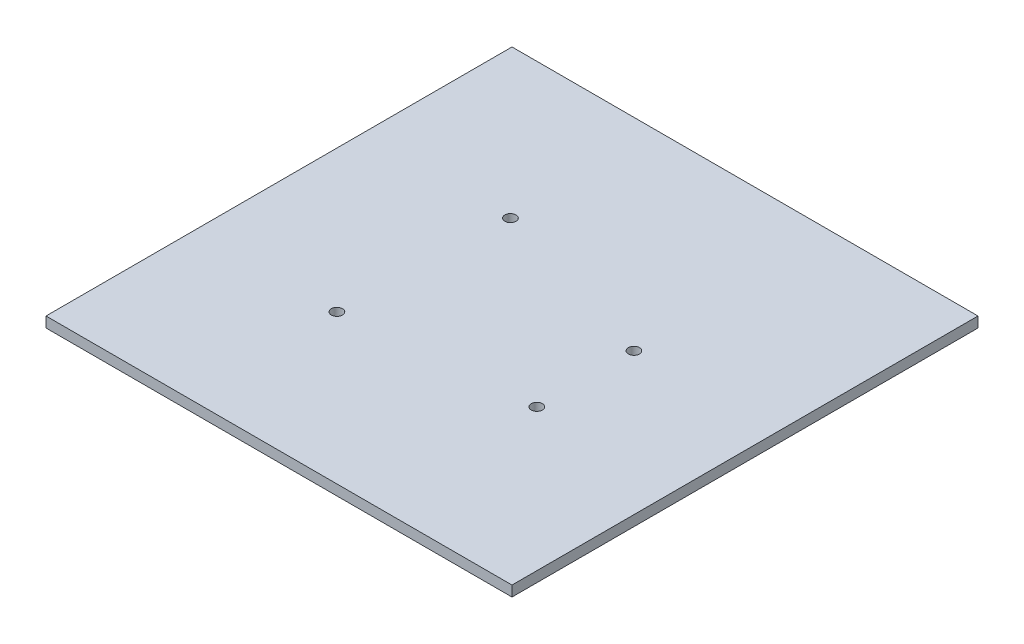
ISO-10303-21;
HEADER;
FILE_DESCRIPTION(('STEP AP214'),'2;1');
FILE_NAME('part.step','',(''),(''),'','','');
FILE_SCHEMA(('AUTOMOTIVE_DESIGN { 1 0 10303 214 1 1 1 1 }'));
ENDSEC;
DATA;
#1=APPLICATION_CONTEXT('core data for automotive mechanical design processes');
#2=APPLICATION_PROTOCOL_DEFINITION('international standard','automotive_design',2000,#1);
#3=PRODUCT_CONTEXT('',#1,'mechanical');
#4=PRODUCT('Part','Part','',(#3));
#5=PRODUCT_RELATED_PRODUCT_CATEGORY('part','',(#4));
#6=PRODUCT_DEFINITION_FORMATION('','',#4);
#7=PRODUCT_DEFINITION_CONTEXT('part definition',#1,'design');
#8=PRODUCT_DEFINITION('design','',#6,#7);
#9=PRODUCT_DEFINITION_SHAPE('','',#8);
#10=(LENGTH_UNIT() NAMED_UNIT(*) SI_UNIT(.MILLI.,.METRE.));
#11=(NAMED_UNIT(*) PLANE_ANGLE_UNIT() SI_UNIT($,.RADIAN.));
#12=(NAMED_UNIT(*) SI_UNIT($,.STERADIAN.) SOLID_ANGLE_UNIT());
#13=UNCERTAINTY_MEASURE_WITH_UNIT(LENGTH_MEASURE(1.E-05),#10,'distance_accuracy_value','');
#14=(GEOMETRIC_REPRESENTATION_CONTEXT(3) GLOBAL_UNCERTAINTY_ASSIGNED_CONTEXT((#13)) GLOBAL_UNIT_ASSIGNED_CONTEXT((#10,
#11,#12)) REPRESENTATION_CONTEXT('',''));
#15=CARTESIAN_POINT('',(0.,0.,0.));
#16=DIRECTION('',(0.,0.,1.));
#17=DIRECTION('',(1.,0.,0.));
#18=AXIS2_PLACEMENT_3D('',#15,#16,#17);
#19=CARTESIAN_POINT('',(-67.,3.,0.));
#20=DIRECTION('',(1.,0.,0.));
#21=DIRECTION('',(0.,0.,-1.));
#22=AXIS2_PLACEMENT_3D('',#19,#20,#21);
#23=PLANE('',#22);
#24=DIRECTION('',(0.,0.,1.));
#25=VECTOR('',#24,1.);
#26=CARTESIAN_POINT('',(-67.,0.,0.));
#27=LINE('',#26,#25);
#28=CARTESIAN_POINT('',(-67.,0.,-67.));
#29=VERTEX_POINT('',#28);
#30=CARTESIAN_POINT('',(-67.,0.,67.));
#31=VERTEX_POINT('',#30);
#32=EDGE_CURVE('E127',#29,#31,#27,.T.);
#33=ORIENTED_EDGE('',*,*,#32,.T.);
#34=DIRECTION('',(0.,-1.,0.));
#35=VECTOR('',#34,1.);
#36=CARTESIAN_POINT('',(-67.,3.,67.));
#37=LINE('',#36,#35);
#38=CARTESIAN_POINT('',(-67.,3.,67.));
#39=VERTEX_POINT('',#38);
#40=EDGE_CURVE('E11',#39,#31,#37,.T.);
#41=ORIENTED_EDGE('',*,*,#40,.F.);
#42=DIRECTION('',(0.,0.,1.));
#43=VECTOR('',#42,1.);
#44=CARTESIAN_POINT('',(-67.,3.,0.));
#45=LINE('',#44,#43);
#46=CARTESIAN_POINT('',(-67.,3.,-67.));
#47=VERTEX_POINT('',#46);
#48=EDGE_CURVE('E93',#47,#39,#45,.T.);
#49=ORIENTED_EDGE('',*,*,#48,.F.);
#50=DIRECTION('',(0.,-1.,0.));
#51=VECTOR('',#50,1.);
#52=CARTESIAN_POINT('',(-67.,3.,-67.));
#53=LINE('',#52,#51);
#54=EDGE_CURVE('E59',#47,#29,#53,.T.);
#55=ORIENTED_EDGE('',*,*,#54,.T.);
#56=EDGE_LOOP('',(#33,#41,#49,#55));
#57=FACE_BOUND('',#56,.T.);
#58=ADVANCED_FACE('F41',(#57),#23,.F.);
#59=CARTESIAN_POINT('',(0.,3.,67.));
#60=DIRECTION('',(0.,0.,-1.));
#61=DIRECTION('',(-1.,0.,0.));
#62=AXIS2_PLACEMENT_3D('',#59,#60,#61);
#63=PLANE('',#62);
#64=DIRECTION('',(1.,0.,0.));
#65=VECTOR('',#64,1.);
#66=CARTESIAN_POINT('',(0.,0.,67.));
#67=LINE('',#66,#65);
#68=CARTESIAN_POINT('',(67.,0.,67.));
#69=VERTEX_POINT('',#68);
#70=EDGE_CURVE('E99',#31,#69,#67,.T.);
#71=ORIENTED_EDGE('',*,*,#70,.T.);
#72=DIRECTION('',(0.,-1.,0.));
#73=VECTOR('',#72,1.);
#74=CARTESIAN_POINT('',(67.,3.,67.));
#75=LINE('',#74,#73);
#76=CARTESIAN_POINT('',(67.,3.,67.));
#77=VERTEX_POINT('',#76);
#78=EDGE_CURVE('E51',#77,#69,#75,.T.);
#79=ORIENTED_EDGE('',*,*,#78,.F.);
#80=DIRECTION('',(1.,0.,0.));
#81=VECTOR('',#80,1.);
#82=CARTESIAN_POINT('',(0.,3.,67.));
#83=LINE('',#82,#81);
#84=EDGE_CURVE('E84',#39,#77,#83,.T.);
#85=ORIENTED_EDGE('',*,*,#84,.F.);
#86=ORIENTED_EDGE('',*,*,#40,.T.);
#87=EDGE_LOOP('',(#71,#79,#85,#86));
#88=FACE_BOUND('',#87,.T.);
#89=ADVANCED_FACE('F98',(#88),#63,.F.);
#90=CARTESIAN_POINT('',(67.,3.,0.));
#91=DIRECTION('',(1.,0.,0.));
#92=DIRECTION('',(0.,0.,-1.));
#93=AXIS2_PLACEMENT_3D('',#90,#91,#92);
#94=PLANE('',#93);
#95=DIRECTION('',(0.,0.,1.));
#96=VECTOR('',#95,1.);
#97=CARTESIAN_POINT('',(67.,0.,0.));
#98=LINE('',#97,#96);
#99=CARTESIAN_POINT('',(67.,0.,-67.));
#100=VERTEX_POINT('',#99);
#101=EDGE_CURVE('E132',#100,#69,#98,.T.);
#102=ORIENTED_EDGE('',*,*,#101,.F.);
#103=DIRECTION('',(0.,-1.,0.));
#104=VECTOR('',#103,1.);
#105=CARTESIAN_POINT('',(67.,3.,-67.));
#106=LINE('',#105,#104);
#107=CARTESIAN_POINT('',(67.,3.,-67.));
#108=VERTEX_POINT('',#107);
#109=EDGE_CURVE('E73',#108,#100,#106,.T.);
#110=ORIENTED_EDGE('',*,*,#109,.F.);
#111=DIRECTION('',(0.,0.,1.));
#112=VECTOR('',#111,1.);
#113=CARTESIAN_POINT('',(67.,3.,0.));
#114=LINE('',#113,#112);
#115=EDGE_CURVE('E92',#108,#77,#114,.T.);
#116=ORIENTED_EDGE('',*,*,#115,.T.);
#117=ORIENTED_EDGE('',*,*,#78,.T.);
#118=EDGE_LOOP('',(#102,#110,#116,#117));
#119=FACE_BOUND('',#118,.T.);
#120=ADVANCED_FACE('F103',(#119),#94,.T.);
#121=CARTESIAN_POINT('',(26.2,3.,19.05));
#122=DIRECTION('',(0.,-1.,0.));
#123=DIRECTION('',(0.,0.,-1.));
#124=AXIS2_PLACEMENT_3D('',#121,#122,#123);
#125=CYLINDRICAL_SURFACE('',#124,1.6);
#126=CARTESIAN_POINT('',(26.2,3.,19.05));
#127=DIRECTION('',(0.,1.,0.));
#128=DIRECTION('',(0.,0.,1.));
#129=AXIS2_PLACEMENT_3D('',#126,#127,#128);
#130=CIRCLE('',#129,1.6);
#131=CARTESIAN_POINT('',(26.2,3.,20.65));
#132=VERTEX_POINT('',#131);
#133=EDGE_CURVE('E115',#132,#132,#130,.T.);
#134=ORIENTED_EDGE('',*,*,#133,.T.);
#135=EDGE_LOOP('',(#134));
#136=FACE_BOUND('',#135,.T.);
#137=CARTESIAN_POINT('',(26.2,0.,19.05));
#138=DIRECTION('',(0.,1.,0.));
#139=DIRECTION('',(0.,0.,1.));
#140=AXIS2_PLACEMENT_3D('',#137,#138,#139);
#141=CIRCLE('',#140,1.6);
#142=CARTESIAN_POINT('',(26.2,0.,20.65));
#143=VERTEX_POINT('',#142);
#144=EDGE_CURVE('E143',#143,#143,#141,.T.);
#145=ORIENTED_EDGE('',*,*,#144,.F.);
#146=EDGE_LOOP('',(#145));
#147=FACE_BOUND('',#146,.T.);
#148=ADVANCED_FACE('F185',(#136,#147),#125,.F.);
#149=CARTESIAN_POINT('',(-26.2,3.,24.15));
#150=DIRECTION('',(0.,-1.,0.));
#151=DIRECTION('',(0.,0.,-1.));
#152=AXIS2_PLACEMENT_3D('',#149,#150,#151);
#153=CYLINDRICAL_SURFACE('',#152,1.6);
#154=CARTESIAN_POINT('',(-26.2,3.,24.15));
#155=DIRECTION('',(0.,1.,0.));
#156=DIRECTION('',(0.,0.,1.));
#157=AXIS2_PLACEMENT_3D('',#154,#155,#156);
#158=CIRCLE('',#157,1.6);
#159=CARTESIAN_POINT('',(-26.2,3.,25.75));
#160=VERTEX_POINT('',#159);
#161=EDGE_CURVE('E108',#160,#160,#158,.T.);
#162=ORIENTED_EDGE('',*,*,#161,.T.);
#163=EDGE_LOOP('',(#162));
#164=FACE_BOUND('',#163,.T.);
#165=CARTESIAN_POINT('',(-26.2,0.,24.15));
#166=DIRECTION('',(0.,1.,0.));
#167=DIRECTION('',(0.,0.,1.));
#168=AXIS2_PLACEMENT_3D('',#165,#166,#167);
#169=CIRCLE('',#168,1.6);
#170=CARTESIAN_POINT('',(-26.2,0.,25.75));
#171=VERTEX_POINT('',#170);
#172=EDGE_CURVE('E139',#171,#171,#169,.T.);
#173=ORIENTED_EDGE('',*,*,#172,.F.);
#174=EDGE_LOOP('',(#173));
#175=FACE_BOUND('',#174,.T.);
#176=ADVANCED_FACE('F189',(#164,#175),#153,.F.);
#177=CARTESIAN_POINT('',(0.,3.,-67.));
#178=DIRECTION('',(0.,0.,-1.));
#179=DIRECTION('',(-1.,0.,0.));
#180=AXIS2_PLACEMENT_3D('',#177,#178,#179);
#181=PLANE('',#180);
#182=DIRECTION('',(1.,0.,0.));
#183=VECTOR('',#182,1.);
#184=CARTESIAN_POINT('',(0.,0.,-67.));
#185=LINE('',#184,#183);
#186=EDGE_CURVE('E135',#29,#100,#185,.T.);
#187=ORIENTED_EDGE('',*,*,#186,.F.);
#188=ORIENTED_EDGE('',*,*,#54,.F.);
#189=DIRECTION('',(1.,0.,0.));
#190=VECTOR('',#189,1.);
#191=CARTESIAN_POINT('',(0.,3.,-67.));
#192=LINE('',#191,#190);
#193=EDGE_CURVE('E105',#47,#108,#192,.T.);
#194=ORIENTED_EDGE('',*,*,#193,.T.);
#195=ORIENTED_EDGE('',*,*,#109,.T.);
#196=EDGE_LOOP('',(#187,#188,#194,#195));
#197=FACE_BOUND('',#196,.T.);
#198=ADVANCED_FACE('F186',(#197),#181,.T.);
#199=CARTESIAN_POINT('',(-24.6,3.,-24.15));
#200=DIRECTION('',(0.,-1.,0.));
#201=DIRECTION('',(0.,0.,-1.));
#202=AXIS2_PLACEMENT_3D('',#199,#200,#201);
#203=CYLINDRICAL_SURFACE('',#202,1.6);
#204=CARTESIAN_POINT('',(-24.6,3.,-24.15));
#205=DIRECTION('',(0.,1.,0.));
#206=DIRECTION('',(0.,0.,1.));
#207=AXIS2_PLACEMENT_3D('',#204,#205,#206);
#208=CIRCLE('',#207,1.6);
#209=CARTESIAN_POINT('',(-24.6,3.,-22.55));
#210=VERTEX_POINT('',#209);
#211=EDGE_CURVE('E151',#210,#210,#208,.T.);
#212=ORIENTED_EDGE('',*,*,#211,.T.);
#213=EDGE_LOOP('',(#212));
#214=FACE_BOUND('',#213,.T.);
#215=CARTESIAN_POINT('',(-24.6,0.,-24.15));
#216=DIRECTION('',(0.,1.,0.));
#217=DIRECTION('',(0.,0.,1.));
#218=AXIS2_PLACEMENT_3D('',#215,#216,#217);
#219=CIRCLE('',#218,1.6);
#220=CARTESIAN_POINT('',(-24.6,0.,-22.55));
#221=VERTEX_POINT('',#220);
#222=EDGE_CURVE('E123',#221,#221,#219,.T.);
#223=ORIENTED_EDGE('',*,*,#222,.F.);
#224=EDGE_LOOP('',(#223));
#225=FACE_BOUND('',#224,.T.);
#226=ADVANCED_FACE('F43',(#214,#225),#203,.F.);
#227=CARTESIAN_POINT('',(26.2,3.,-8.85));
#228=DIRECTION('',(0.,-1.,0.));
#229=DIRECTION('',(0.,0.,-1.));
#230=AXIS2_PLACEMENT_3D('',#227,#228,#229);
#231=CYLINDRICAL_SURFACE('',#230,1.6);
#232=CARTESIAN_POINT('',(26.2,3.,-8.85));
#233=DIRECTION('',(0.,1.,0.));
#234=DIRECTION('',(0.,0.,1.));
#235=AXIS2_PLACEMENT_3D('',#232,#233,#234);
#236=CIRCLE('',#235,1.6);
#237=CARTESIAN_POINT('',(26.2,3.,-7.25));
#238=VERTEX_POINT('',#237);
#239=EDGE_CURVE('E119',#238,#238,#236,.T.);
#240=ORIENTED_EDGE('',*,*,#239,.T.);
#241=EDGE_LOOP('',(#240));
#242=FACE_BOUND('',#241,.T.);
#243=CARTESIAN_POINT('',(26.2,0.,-8.85));
#244=DIRECTION('',(0.,1.,0.));
#245=DIRECTION('',(0.,0.,1.));
#246=AXIS2_PLACEMENT_3D('',#243,#244,#245);
#247=CIRCLE('',#246,1.6);
#248=CARTESIAN_POINT('',(26.2,0.,-7.25));
#249=VERTEX_POINT('',#248);
#250=EDGE_CURVE('E147',#249,#249,#247,.T.);
#251=ORIENTED_EDGE('',*,*,#250,.F.);
#252=EDGE_LOOP('',(#251));
#253=FACE_BOUND('',#252,.T.);
#254=ADVANCED_FACE('F167',(#242,#253),#231,.F.);
#255=CARTESIAN_POINT('',(0.,3.,0.));
#256=DIRECTION('',(0.,1.,0.));
#257=DIRECTION('',(0.,0.,1.));
#258=AXIS2_PLACEMENT_3D('',#255,#256,#257);
#259=PLANE('',#258);
#260=ORIENTED_EDGE('',*,*,#211,.F.);
#261=EDGE_LOOP('',(#260));
#262=FACE_BOUND('',#261,.T.);
#263=ORIENTED_EDGE('',*,*,#48,.T.);
#264=ORIENTED_EDGE('',*,*,#84,.T.);
#265=ORIENTED_EDGE('',*,*,#115,.F.);
#266=ORIENTED_EDGE('',*,*,#193,.F.);
#267=EDGE_LOOP('',(#263,#264,#265,#266));
#268=FACE_BOUND('',#267,.T.);
#269=ORIENTED_EDGE('',*,*,#161,.F.);
#270=EDGE_LOOP('',(#269));
#271=FACE_BOUND('',#270,.T.);
#272=ORIENTED_EDGE('',*,*,#133,.F.);
#273=EDGE_LOOP('',(#272));
#274=FACE_BOUND('',#273,.T.);
#275=ORIENTED_EDGE('',*,*,#239,.F.);
#276=EDGE_LOOP('',(#275));
#277=FACE_BOUND('',#276,.T.);
#278=ADVANCED_FACE('F88',(#262,#268,#271,#274,#277),#259,.T.);
#279=CARTESIAN_POINT('',(0.,0.,0.));
#280=DIRECTION('',(0.,1.,0.));
#281=DIRECTION('',(0.,0.,1.));
#282=AXIS2_PLACEMENT_3D('',#279,#280,#281);
#283=PLANE('',#282);
#284=ORIENTED_EDGE('',*,*,#222,.T.);
#285=EDGE_LOOP('',(#284));
#286=FACE_BOUND('',#285,.T.);
#287=ORIENTED_EDGE('',*,*,#32,.F.);
#288=ORIENTED_EDGE('',*,*,#186,.T.);
#289=ORIENTED_EDGE('',*,*,#101,.T.);
#290=ORIENTED_EDGE('',*,*,#70,.F.);
#291=EDGE_LOOP('',(#287,#288,#289,#290));
#292=FACE_BOUND('',#291,.T.);
#293=ORIENTED_EDGE('',*,*,#172,.T.);
#294=EDGE_LOOP('',(#293));
#295=FACE_BOUND('',#294,.T.);
#296=ORIENTED_EDGE('',*,*,#144,.T.);
#297=EDGE_LOOP('',(#296));
#298=FACE_BOUND('',#297,.T.);
#299=ORIENTED_EDGE('',*,*,#250,.T.);
#300=EDGE_LOOP('',(#299));
#301=FACE_BOUND('',#300,.T.);
#302=ADVANCED_FACE('F166',(#286,#292,#295,#298,#301),#283,.F.);
#303=CLOSED_SHELL('',(#58,#89,#120,#148,#176,#198,#226,#254,#278,#302));
#304=MANIFOLD_SOLID_BREP('B2',#303);
#305=ADVANCED_BREP_SHAPE_REPRESENTATION('',(#18,#304),#14);
#306=SHAPE_DEFINITION_REPRESENTATION(#9,#305);
ENDSEC;
END-ISO-10303-21;
